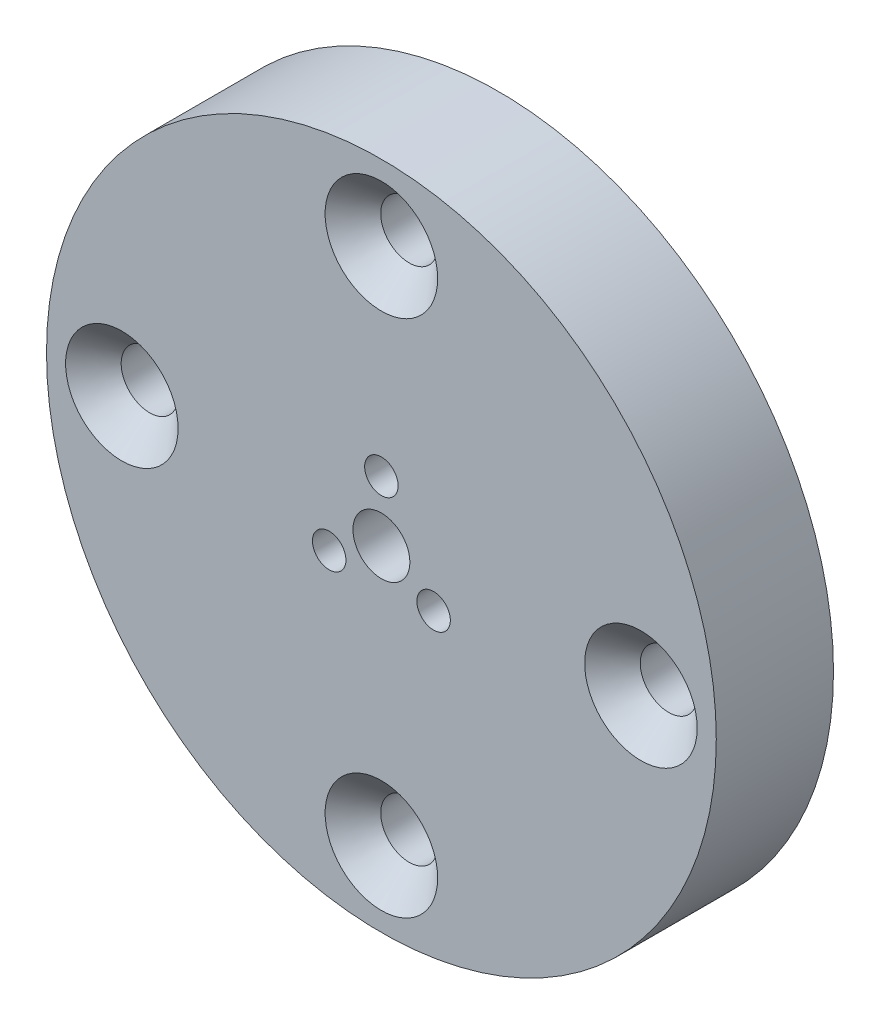
ISO-10303-21;
HEADER;
FILE_DESCRIPTION(('STEP AP214'),'2;1');
FILE_NAME('part.step','',(''),(''),'','','');
FILE_SCHEMA(('AUTOMOTIVE_DESIGN { 1 0 10303 214 1 1 1 1 }'));
ENDSEC;
DATA;
#1=APPLICATION_CONTEXT('core data for automotive mechanical design processes');
#2=APPLICATION_PROTOCOL_DEFINITION('international standard','automotive_design',2000,#1);
#3=PRODUCT_CONTEXT('',#1,'mechanical');
#4=PRODUCT('Part','Part','',(#3));
#5=PRODUCT_RELATED_PRODUCT_CATEGORY('part','',(#4));
#6=PRODUCT_DEFINITION_FORMATION('','',#4);
#7=PRODUCT_DEFINITION_CONTEXT('part definition',#1,'design');
#8=PRODUCT_DEFINITION('design','',#6,#7);
#9=PRODUCT_DEFINITION_SHAPE('','',#8);
#10=(LENGTH_UNIT() NAMED_UNIT(*) SI_UNIT(.MILLI.,.METRE.));
#11=(NAMED_UNIT(*) PLANE_ANGLE_UNIT() SI_UNIT($,.RADIAN.));
#12=(NAMED_UNIT(*) SI_UNIT($,.STERADIAN.) SOLID_ANGLE_UNIT());
#13=UNCERTAINTY_MEASURE_WITH_UNIT(LENGTH_MEASURE(1.E-05),#10,'distance_accuracy_value','');
#14=(GEOMETRIC_REPRESENTATION_CONTEXT(3) GLOBAL_UNCERTAINTY_ASSIGNED_CONTEXT((#13)) GLOBAL_UNIT_ASSIGNED_CONTEXT((#10,
#11,#12)) REPRESENTATION_CONTEXT('',''));
#15=CARTESIAN_POINT('',(0.,0.,0.));
#16=DIRECTION('',(0.,0.,1.));
#17=DIRECTION('',(1.,0.,0.));
#18=AXIS2_PLACEMENT_3D('',#15,#16,#17);
#19=CARTESIAN_POINT('',(0.,3.6,7.));
#20=DIRECTION('',(0.,0.,-1.));
#21=DIRECTION('',(-1.,0.,0.));
#22=AXIS2_PLACEMENT_3D('',#19,#20,#21);
#23=CYLINDRICAL_SURFACE('',#22,1.);
#24=CARTESIAN_POINT('',(0.,3.6,7.));
#25=DIRECTION('',(0.,0.,1.));
#26=DIRECTION('',(1.,0.,0.));
#27=AXIS2_PLACEMENT_3D('',#24,#25,#26);
#28=CIRCLE('',#27,1.);
#29=CARTESIAN_POINT('',(1.,3.6,7.));
#30=VERTEX_POINT('',#29);
#31=EDGE_CURVE('E44',#30,#30,#28,.T.);
#32=ORIENTED_EDGE('',*,*,#31,.T.);
#33=EDGE_LOOP('',(#32));
#34=FACE_BOUND('',#33,.T.);
#35=CARTESIAN_POINT('',(0.,3.6,3.));
#36=DIRECTION('',(0.,0.,-1.));
#37=DIRECTION('',(-1.,0.,0.));
#38=AXIS2_PLACEMENT_3D('',#35,#36,#37);
#39=CIRCLE('',#38,1.);
#40=CARTESIAN_POINT('',(-1.,3.6,3.));
#41=VERTEX_POINT('',#40);
#42=EDGE_CURVE('E93',#41,#41,#39,.T.);
#43=ORIENTED_EDGE('',*,*,#42,.T.);
#44=EDGE_LOOP('',(#43));
#45=FACE_BOUND('',#44,.T.);
#46=ADVANCED_FACE('F31',(#34,#45),#23,.F.);
#47=CARTESIAN_POINT('',(3.11769145362421,-1.79999999999987,7.));
#48=DIRECTION('',(0.,0.,-1.));
#49=DIRECTION('',(-1.,0.,0.));
#50=AXIS2_PLACEMENT_3D('',#47,#48,#49);
#51=CYLINDRICAL_SURFACE('',#50,1.0000000000002);
#52=CARTESIAN_POINT('',(3.11769145362421,-1.79999999999987,7.));
#53=DIRECTION('',(0.,0.,1.));
#54=DIRECTION('',(1.,0.,0.));
#55=AXIS2_PLACEMENT_3D('',#52,#53,#54);
#56=CIRCLE('',#55,1.0000000000002);
#57=CARTESIAN_POINT('',(4.11769145362441,-1.79999999999987,7.));
#58=VERTEX_POINT('',#57);
#59=EDGE_CURVE('E48',#58,#58,#56,.T.);
#60=ORIENTED_EDGE('',*,*,#59,.T.);
#61=EDGE_LOOP('',(#60));
#62=FACE_BOUND('',#61,.T.);
#63=CARTESIAN_POINT('',(3.11769145362421,-1.79999999999987,3.));
#64=DIRECTION('',(0.,0.,-1.));
#65=DIRECTION('',(-1.,0.,0.));
#66=AXIS2_PLACEMENT_3D('',#63,#64,#65);
#67=CIRCLE('',#66,1.0000000000002);
#68=CARTESIAN_POINT('',(2.11769145362401,-1.79999999999987,3.));
#69=VERTEX_POINT('',#68);
#70=EDGE_CURVE('E96',#69,#69,#67,.T.);
#71=ORIENTED_EDGE('',*,*,#70,.T.);
#72=EDGE_LOOP('',(#71));
#73=FACE_BOUND('',#72,.T.);
#74=ADVANCED_FACE('F127',(#62,#73),#51,.F.);
#75=CARTESIAN_POINT('',(-3.11769145362375,-1.80000000000013,7.));
#76=DIRECTION('',(0.,0.,-1.));
#77=DIRECTION('',(-1.,0.,0.));
#78=AXIS2_PLACEMENT_3D('',#75,#76,#77);
#79=CYLINDRICAL_SURFACE('',#78,1.00000000000029);
#80=CARTESIAN_POINT('',(-3.11769145362375,-1.80000000000013,7.));
#81=DIRECTION('',(0.,0.,1.));
#82=DIRECTION('',(1.,0.,0.));
#83=AXIS2_PLACEMENT_3D('',#80,#81,#82);
#84=CIRCLE('',#83,1.00000000000029);
#85=CARTESIAN_POINT('',(-2.11769145362346,-1.80000000000013,7.));
#86=VERTEX_POINT('',#85);
#87=EDGE_CURVE('E51',#86,#86,#84,.T.);
#88=ORIENTED_EDGE('',*,*,#87,.T.);
#89=EDGE_LOOP('',(#88));
#90=FACE_BOUND('',#89,.T.);
#91=CARTESIAN_POINT('',(-3.11769145362375,-1.80000000000013,3.));
#92=DIRECTION('',(0.,0.,-1.));
#93=DIRECTION('',(-1.,0.,0.));
#94=AXIS2_PLACEMENT_3D('',#91,#92,#93);
#95=CIRCLE('',#94,1.00000000000029);
#96=CARTESIAN_POINT('',(-4.11769145362404,-1.80000000000013,3.));
#97=VERTEX_POINT('',#96);
#98=EDGE_CURVE('E99',#97,#97,#95,.T.);
#99=ORIENTED_EDGE('',*,*,#98,.T.);
#100=EDGE_LOOP('',(#99));
#101=FACE_BOUND('',#100,.T.);
#102=ADVANCED_FACE('F117',(#90,#101),#79,.F.);
#103=CARTESIAN_POINT('',(0.,0.,7.));
#104=DIRECTION('',(0.,0.,1.));
#105=DIRECTION('',(1.,0.,0.));
#106=AXIS2_PLACEMENT_3D('',#103,#104,#105);
#107=CYLINDRICAL_SURFACE('',#106,1.69999999999999);
#108=CARTESIAN_POINT('',(0.,0.,7.));
#109=DIRECTION('',(0.,0.,1.));
#110=DIRECTION('',(1.,0.,0.));
#111=AXIS2_PLACEMENT_3D('',#108,#109,#110);
#112=CIRCLE('',#111,1.69999999999999);
#113=CARTESIAN_POINT('',(1.69999999999999,0.,7.));
#114=VERTEX_POINT('',#113);
#115=EDGE_CURVE('E90',#114,#114,#112,.T.);
#116=ORIENTED_EDGE('',*,*,#115,.T.);
#117=EDGE_LOOP('',(#116));
#118=FACE_BOUND('',#117,.T.);
#119=CARTESIAN_POINT('',(0.,0.,3.));
#120=DIRECTION('',(0.,0.,-1.));
#121=DIRECTION('',(-1.,0.,0.));
#122=AXIS2_PLACEMENT_3D('',#119,#120,#121);
#123=CIRCLE('',#122,1.69999999999999);
#124=CARTESIAN_POINT('',(-1.69999999999999,0.,3.));
#125=VERTEX_POINT('',#124);
#126=EDGE_CURVE('E35',#125,#125,#123,.F.);
#127=ORIENTED_EDGE('',*,*,#126,.F.);
#128=EDGE_LOOP('',(#127));
#129=FACE_BOUND('',#128,.T.);
#130=ADVANCED_FACE('F114',(#118,#129),#107,.F.);
#131=CARTESIAN_POINT('',(0.,0.,7.));
#132=DIRECTION('',(0.,0.,1.));
#133=DIRECTION('',(1.,0.,0.));
#134=AXIS2_PLACEMENT_3D('',#131,#132,#133);
#135=PLANE('',#134);
#136=ORIENTED_EDGE('',*,*,#115,.F.);
#137=EDGE_LOOP('',(#136));
#138=FACE_BOUND('',#137,.T.);
#139=CARTESIAN_POINT('',(0.,15.5,7.));
#140=DIRECTION('',(0.,0.,1.));
#141=DIRECTION('',(1.,0.,0.));
#142=AXIS2_PLACEMENT_3D('',#139,#140,#141);
#143=CIRCLE('',#142,3.36);
#144=CARTESIAN_POINT('',(3.36,15.5,7.));
#145=VERTEX_POINT('',#144);
#146=EDGE_CURVE('E87',#145,#145,#143,.T.);
#147=ORIENTED_EDGE('',*,*,#146,.F.);
#148=EDGE_LOOP('',(#147));
#149=FACE_BOUND('',#148,.T.);
#150=CARTESIAN_POINT('',(15.5000000000004,3.6609757468135E-13,7.));
#151=DIRECTION('',(0.,0.,1.));
#152=DIRECTION('',(1.,0.,0.));
#153=AXIS2_PLACEMENT_3D('',#150,#151,#152);
#154=CIRCLE('',#153,3.36);
#155=CARTESIAN_POINT('',(18.8600000000004,3.6609757468135E-13,7.));
#156=VERTEX_POINT('',#155);
#157=EDGE_CURVE('E78',#156,#156,#154,.T.);
#158=ORIENTED_EDGE('',*,*,#157,.F.);
#159=EDGE_LOOP('',(#158));
#160=FACE_BOUND('',#159,.T.);
#161=CARTESIAN_POINT('',(7.32195149362699E-13,-15.5,7.));
#162=DIRECTION('',(0.,0.,1.));
#163=DIRECTION('',(1.,0.,0.));
#164=AXIS2_PLACEMENT_3D('',#161,#162,#163);
#165=CIRCLE('',#164,3.36);
#166=CARTESIAN_POINT('',(3.36000000000073,-15.5,7.));
#167=VERTEX_POINT('',#166);
#168=EDGE_CURVE('E69',#167,#167,#165,.T.);
#169=ORIENTED_EDGE('',*,*,#168,.F.);
#170=EDGE_LOOP('',(#169));
#171=FACE_BOUND('',#170,.T.);
#172=CARTESIAN_POINT('',(-15.4999999999996,-3.64199372142671E-13,7.));
#173=DIRECTION('',(0.,0.,1.));
#174=DIRECTION('',(1.,0.,0.));
#175=AXIS2_PLACEMENT_3D('',#172,#173,#174);
#176=CIRCLE('',#175,3.36);
#177=CARTESIAN_POINT('',(-12.1399999999996,-3.64199372142671E-13,7.));
#178=VERTEX_POINT('',#177);
#179=EDGE_CURVE('E60',#178,#178,#176,.T.);
#180=ORIENTED_EDGE('',*,*,#179,.F.);
#181=EDGE_LOOP('',(#180));
#182=FACE_BOUND('',#181,.T.);
#183=ORIENTED_EDGE('',*,*,#59,.F.);
#184=EDGE_LOOP('',(#183));
#185=FACE_BOUND('',#184,.T.);
#186=CARTESIAN_POINT('',(0.,0.,7.));
#187=DIRECTION('',(0.,0.,1.));
#188=DIRECTION('',(1.,0.,0.));
#189=AXIS2_PLACEMENT_3D('',#186,#187,#188);
#190=CIRCLE('',#189,20.);
#191=CARTESIAN_POINT('',(20.,0.,7.));
#192=VERTEX_POINT('',#191);
#193=EDGE_CURVE('E10',#192,#192,#190,.T.);
#194=ORIENTED_EDGE('',*,*,#193,.T.);
#195=EDGE_LOOP('',(#194));
#196=FACE_BOUND('',#195,.T.);
#197=ORIENTED_EDGE('',*,*,#31,.F.);
#198=EDGE_LOOP('',(#197));
#199=FACE_BOUND('',#198,.T.);
#200=ORIENTED_EDGE('',*,*,#87,.F.);
#201=EDGE_LOOP('',(#200));
#202=FACE_BOUND('',#201,.T.);
#203=ADVANCED_FACE('F116',(#138,#149,#160,#171,#182,#185,#196,#199,#202),#135,.T.);
#204=CARTESIAN_POINT('',(0.,0.,0.));
#205=DIRECTION('',(0.,0.,1.));
#206=DIRECTION('',(1.,0.,0.));
#207=AXIS2_PLACEMENT_3D('',#204,#205,#206);
#208=PLANE('',#207);
#209=CARTESIAN_POINT('',(0.,0.,0.));
#210=DIRECTION('',(0.,0.,-1.));
#211=DIRECTION('',(-1.,0.,0.));
#212=AXIS2_PLACEMENT_3D('',#209,#210,#211);
#213=CIRCLE('',#212,5.);
#214=CARTESIAN_POINT('',(-5.,0.,0.));
#215=VERTEX_POINT('',#214);
#216=EDGE_CURVE('E102',#215,#215,#213,.T.);
#217=ORIENTED_EDGE('',*,*,#216,.F.);
#218=EDGE_LOOP('',(#217));
#219=FACE_BOUND('',#218,.T.);
#220=CARTESIAN_POINT('',(0.,15.5,0.));
#221=DIRECTION('',(0.,0.,1.));
#222=DIRECTION('',(1.,0.,0.));
#223=AXIS2_PLACEMENT_3D('',#220,#221,#222);
#224=CIRCLE('',#223,1.7);
#225=CARTESIAN_POINT('',(1.7,15.5,0.));
#226=VERTEX_POINT('',#225);
#227=EDGE_CURVE('E81',#226,#226,#224,.T.);
#228=ORIENTED_EDGE('',*,*,#227,.T.);
#229=EDGE_LOOP('',(#228));
#230=FACE_BOUND('',#229,.T.);
#231=CARTESIAN_POINT('',(15.5000000000004,3.6609757468135E-13,0.));
#232=DIRECTION('',(0.,0.,1.));
#233=DIRECTION('',(1.,0.,0.));
#234=AXIS2_PLACEMENT_3D('',#231,#232,#233);
#235=CIRCLE('',#234,1.7);
#236=CARTESIAN_POINT('',(17.2000000000004,3.6609757468135E-13,0.));
#237=VERTEX_POINT('',#236);
#238=EDGE_CURVE('E72',#237,#237,#235,.T.);
#239=ORIENTED_EDGE('',*,*,#238,.T.);
#240=EDGE_LOOP('',(#239));
#241=FACE_BOUND('',#240,.T.);
#242=CARTESIAN_POINT('',(7.32195149362699E-13,-15.5,0.));
#243=DIRECTION('',(0.,0.,1.));
#244=DIRECTION('',(1.,0.,0.));
#245=AXIS2_PLACEMENT_3D('',#242,#243,#244);
#246=CIRCLE('',#245,1.7);
#247=CARTESIAN_POINT('',(1.70000000000073,-15.5,0.));
#248=VERTEX_POINT('',#247);
#249=EDGE_CURVE('E63',#248,#248,#246,.T.);
#250=ORIENTED_EDGE('',*,*,#249,.T.);
#251=EDGE_LOOP('',(#250));
#252=FACE_BOUND('',#251,.T.);
#253=CARTESIAN_POINT('',(-15.4999999999996,-3.64199372142671E-13,0.));
#254=DIRECTION('',(0.,0.,1.));
#255=DIRECTION('',(1.,0.,0.));
#256=AXIS2_PLACEMENT_3D('',#253,#254,#255);
#257=CIRCLE('',#256,1.7);
#258=CARTESIAN_POINT('',(-13.7999999999996,-3.64199372142671E-13,0.));
#259=VERTEX_POINT('',#258);
#260=EDGE_CURVE('E54',#259,#259,#257,.T.);
#261=ORIENTED_EDGE('',*,*,#260,.T.);
#262=EDGE_LOOP('',(#261));
#263=FACE_BOUND('',#262,.T.);
#264=CARTESIAN_POINT('',(0.,0.,0.));
#265=DIRECTION('',(0.,0.,1.));
#266=DIRECTION('',(1.,0.,0.));
#267=AXIS2_PLACEMENT_3D('',#264,#265,#266);
#268=CIRCLE('',#267,20.);
#269=CARTESIAN_POINT('',(20.,0.,0.));
#270=VERTEX_POINT('',#269);
#271=EDGE_CURVE('E39',#270,#270,#268,.T.);
#272=ORIENTED_EDGE('',*,*,#271,.F.);
#273=EDGE_LOOP('',(#272));
#274=FACE_BOUND('',#273,.T.);
#275=ADVANCED_FACE('F124',(#219,#230,#241,#252,#263,#274),#208,.F.);
#276=CARTESIAN_POINT('',(0.,0.,7.));
#277=DIRECTION('',(0.,0.,-1.));
#278=DIRECTION('',(-1.,0.,0.));
#279=AXIS2_PLACEMENT_3D('',#276,#277,#278);
#280=CYLINDRICAL_SURFACE('',#279,20.);
#281=ORIENTED_EDGE('',*,*,#193,.F.);
#282=EDGE_LOOP('',(#281));
#283=FACE_BOUND('',#282,.T.);
#284=ORIENTED_EDGE('',*,*,#271,.T.);
#285=EDGE_LOOP('',(#284));
#286=FACE_BOUND('',#285,.T.);
#287=ADVANCED_FACE('F33',(#283,#286),#280,.T.);
#288=CARTESIAN_POINT('',(-15.4999999999996,-3.64199372142671E-13,7.));
#289=DIRECTION('',(0.,0.,1.));
#290=DIRECTION('',(1.,0.,0.));
#291=AXIS2_PLACEMENT_3D('',#288,#289,#290);
#292=CYLINDRICAL_SURFACE('',#291,1.7);
#293=ORIENTED_EDGE('',*,*,#260,.F.);
#294=EDGE_LOOP('',(#293));
#295=FACE_BOUND('',#294,.T.);
#296=CARTESIAN_POINT('',(-15.4999999999996,-3.64199372142671E-13,5.34));
#297=DIRECTION('',(0.,0.,1.));
#298=DIRECTION('',(1.,0.,0.));
#299=AXIS2_PLACEMENT_3D('',#296,#297,#298);
#300=CIRCLE('',#299,1.7);
#301=CARTESIAN_POINT('',(-13.7999999999996,-3.64199372142671E-13,5.34));
#302=VERTEX_POINT('',#301);
#303=EDGE_CURVE('E57',#302,#302,#300,.T.);
#304=ORIENTED_EDGE('',*,*,#303,.T.);
#305=EDGE_LOOP('',(#304));
#306=FACE_BOUND('',#305,.T.);
#307=ADVANCED_FACE('F146',(#295,#306),#292,.F.);
#308=CARTESIAN_POINT('',(-15.4999999999996,-3.64199372142671E-13,7.));
#309=DIRECTION('',(0.,0.,1.));
#310=DIRECTION('',(1.,0.,0.));
#311=AXIS2_PLACEMENT_3D('',#308,#309,#310);
#312=CONICAL_SURFACE('',#311,3.36,0.785398163397449);
#313=ORIENTED_EDGE('',*,*,#303,.F.);
#314=EDGE_LOOP('',(#313));
#315=FACE_BOUND('',#314,.T.);
#316=ORIENTED_EDGE('',*,*,#179,.T.);
#317=EDGE_LOOP('',(#316));
#318=FACE_BOUND('',#317,.T.);
#319=ADVANCED_FACE('F163',(#315,#318),#312,.F.);
#320=CARTESIAN_POINT('',(7.32195149362699E-13,-15.5,7.));
#321=DIRECTION('',(0.,0.,1.));
#322=DIRECTION('',(1.,0.,0.));
#323=AXIS2_PLACEMENT_3D('',#320,#321,#322);
#324=CYLINDRICAL_SURFACE('',#323,1.7);
#325=ORIENTED_EDGE('',*,*,#249,.F.);
#326=EDGE_LOOP('',(#325));
#327=FACE_BOUND('',#326,.T.);
#328=CARTESIAN_POINT('',(7.32195149362699E-13,-15.5,5.34));
#329=DIRECTION('',(0.,0.,1.));
#330=DIRECTION('',(1.,0.,0.));
#331=AXIS2_PLACEMENT_3D('',#328,#329,#330);
#332=CIRCLE('',#331,1.7);
#333=CARTESIAN_POINT('',(1.70000000000073,-15.5,5.34));
#334=VERTEX_POINT('',#333);
#335=EDGE_CURVE('E66',#334,#334,#332,.T.);
#336=ORIENTED_EDGE('',*,*,#335,.T.);
#337=EDGE_LOOP('',(#336));
#338=FACE_BOUND('',#337,.T.);
#339=ADVANCED_FACE('F169',(#327,#338),#324,.F.);
#340=CARTESIAN_POINT('',(7.32195149362699E-13,-15.5,7.));
#341=DIRECTION('',(0.,0.,1.));
#342=DIRECTION('',(1.,0.,0.));
#343=AXIS2_PLACEMENT_3D('',#340,#341,#342);
#344=CONICAL_SURFACE('',#343,3.36,0.785398163397449);
#345=ORIENTED_EDGE('',*,*,#335,.F.);
#346=EDGE_LOOP('',(#345));
#347=FACE_BOUND('',#346,.T.);
#348=ORIENTED_EDGE('',*,*,#168,.T.);
#349=EDGE_LOOP('',(#348));
#350=FACE_BOUND('',#349,.T.);
#351=ADVANCED_FACE('F213',(#347,#350),#344,.F.);
#352=CARTESIAN_POINT('',(15.5000000000004,3.6609757468135E-13,7.));
#353=DIRECTION('',(0.,0.,1.));
#354=DIRECTION('',(1.,0.,0.));
#355=AXIS2_PLACEMENT_3D('',#352,#353,#354);
#356=CYLINDRICAL_SURFACE('',#355,1.7);
#357=ORIENTED_EDGE('',*,*,#238,.F.);
#358=EDGE_LOOP('',(#357));
#359=FACE_BOUND('',#358,.T.);
#360=CARTESIAN_POINT('',(15.5000000000004,3.6609757468135E-13,5.34));
#361=DIRECTION('',(0.,0.,1.));
#362=DIRECTION('',(1.,0.,0.));
#363=AXIS2_PLACEMENT_3D('',#360,#361,#362);
#364=CIRCLE('',#363,1.7);
#365=CARTESIAN_POINT('',(17.2000000000004,3.6609757468135E-13,5.34));
#366=VERTEX_POINT('',#365);
#367=EDGE_CURVE('E75',#366,#366,#364,.T.);
#368=ORIENTED_EDGE('',*,*,#367,.T.);
#369=EDGE_LOOP('',(#368));
#370=FACE_BOUND('',#369,.T.);
#371=ADVANCED_FACE('F209',(#359,#370),#356,.F.);
#372=CARTESIAN_POINT('',(15.5000000000004,3.6609757468135E-13,7.));
#373=DIRECTION('',(0.,0.,1.));
#374=DIRECTION('',(1.,0.,0.));
#375=AXIS2_PLACEMENT_3D('',#372,#373,#374);
#376=CONICAL_SURFACE('',#375,3.36,0.785398163397449);
#377=ORIENTED_EDGE('',*,*,#367,.F.);
#378=EDGE_LOOP('',(#377));
#379=FACE_BOUND('',#378,.T.);
#380=ORIENTED_EDGE('',*,*,#157,.T.);
#381=EDGE_LOOP('',(#380));
#382=FACE_BOUND('',#381,.T.);
#383=ADVANCED_FACE('F201',(#379,#382),#376,.F.);
#384=CARTESIAN_POINT('',(0.,15.5,7.));
#385=DIRECTION('',(0.,0.,1.));
#386=DIRECTION('',(1.,0.,0.));
#387=AXIS2_PLACEMENT_3D('',#384,#385,#386);
#388=CYLINDRICAL_SURFACE('',#387,1.7);
#389=ORIENTED_EDGE('',*,*,#227,.F.);
#390=EDGE_LOOP('',(#389));
#391=FACE_BOUND('',#390,.T.);
#392=CARTESIAN_POINT('',(0.,15.5,5.34));
#393=DIRECTION('',(0.,0.,1.));
#394=DIRECTION('',(1.,0.,0.));
#395=AXIS2_PLACEMENT_3D('',#392,#393,#394);
#396=CIRCLE('',#395,1.7);
#397=CARTESIAN_POINT('',(1.7,15.5,5.34));
#398=VERTEX_POINT('',#397);
#399=EDGE_CURVE('E84',#398,#398,#396,.T.);
#400=ORIENTED_EDGE('',*,*,#399,.T.);
#401=EDGE_LOOP('',(#400));
#402=FACE_BOUND('',#401,.T.);
#403=ADVANCED_FACE('F192',(#391,#402),#388,.F.);
#404=CARTESIAN_POINT('',(0.,15.5,7.));
#405=DIRECTION('',(0.,0.,1.));
#406=DIRECTION('',(1.,0.,0.));
#407=AXIS2_PLACEMENT_3D('',#404,#405,#406);
#408=CONICAL_SURFACE('',#407,3.36,0.785398163397449);
#409=ORIENTED_EDGE('',*,*,#399,.F.);
#410=EDGE_LOOP('',(#409));
#411=FACE_BOUND('',#410,.T.);
#412=ORIENTED_EDGE('',*,*,#146,.T.);
#413=EDGE_LOOP('',(#412));
#414=FACE_BOUND('',#413,.T.);
#415=ADVANCED_FACE('F184',(#411,#414),#408,.F.);
#416=CARTESIAN_POINT('',(0.,0.,3.));
#417=DIRECTION('',(0.,0.,-1.));
#418=DIRECTION('',(-1.,0.,0.));
#419=AXIS2_PLACEMENT_3D('',#416,#417,#418);
#420=PLANE('',#419);
#421=ORIENTED_EDGE('',*,*,#42,.F.);
#422=EDGE_LOOP('',(#421));
#423=FACE_BOUND('',#422,.T.);
#424=ORIENTED_EDGE('',*,*,#70,.F.);
#425=EDGE_LOOP('',(#424));
#426=FACE_BOUND('',#425,.T.);
#427=ORIENTED_EDGE('',*,*,#98,.F.);
#428=EDGE_LOOP('',(#427));
#429=FACE_BOUND('',#428,.T.);
#430=CARTESIAN_POINT('',(0.,0.,3.));
#431=DIRECTION('',(0.,0.,-1.));
#432=DIRECTION('',(-1.,0.,0.));
#433=AXIS2_PLACEMENT_3D('',#430,#431,#432);
#434=CIRCLE('',#433,5.);
#435=CARTESIAN_POINT('',(-5.,0.,3.));
#436=VERTEX_POINT('',#435);
#437=EDGE_CURVE('E105',#436,#436,#434,.T.);
#438=ORIENTED_EDGE('',*,*,#437,.T.);
#439=EDGE_LOOP('',(#438));
#440=FACE_BOUND('',#439,.T.);
#441=ORIENTED_EDGE('',*,*,#126,.T.);
#442=EDGE_LOOP('',(#441));
#443=FACE_BOUND('',#442,.T.);
#444=ADVANCED_FACE('F112',(#423,#426,#429,#440,#443),#420,.T.);
#445=CARTESIAN_POINT('',(0.,0.,3.));
#446=DIRECTION('',(0.,0.,-1.));
#447=DIRECTION('',(-1.,0.,0.));
#448=AXIS2_PLACEMENT_3D('',#445,#446,#447);
#449=CYLINDRICAL_SURFACE('',#448,5.);
#450=ORIENTED_EDGE('',*,*,#437,.F.);
#451=EDGE_LOOP('',(#450));
#452=FACE_BOUND('',#451,.T.);
#453=ORIENTED_EDGE('',*,*,#216,.T.);
#454=EDGE_LOOP('',(#453));
#455=FACE_BOUND('',#454,.T.);
#456=ADVANCED_FACE('F183',(#452,#455),#449,.F.);
#457=CLOSED_SHELL('',(#46,#74,#102,#130,#203,#275,#287,#307,#319,#339,#351,#371,#383,#403,#415,
#444,#456));
#458=MANIFOLD_SOLID_BREP('B2',#457);
#459=ADVANCED_BREP_SHAPE_REPRESENTATION('',(#18,#458),#14);
#460=SHAPE_DEFINITION_REPRESENTATION(#9,#459);
ENDSEC;
END-ISO-10303-21;
